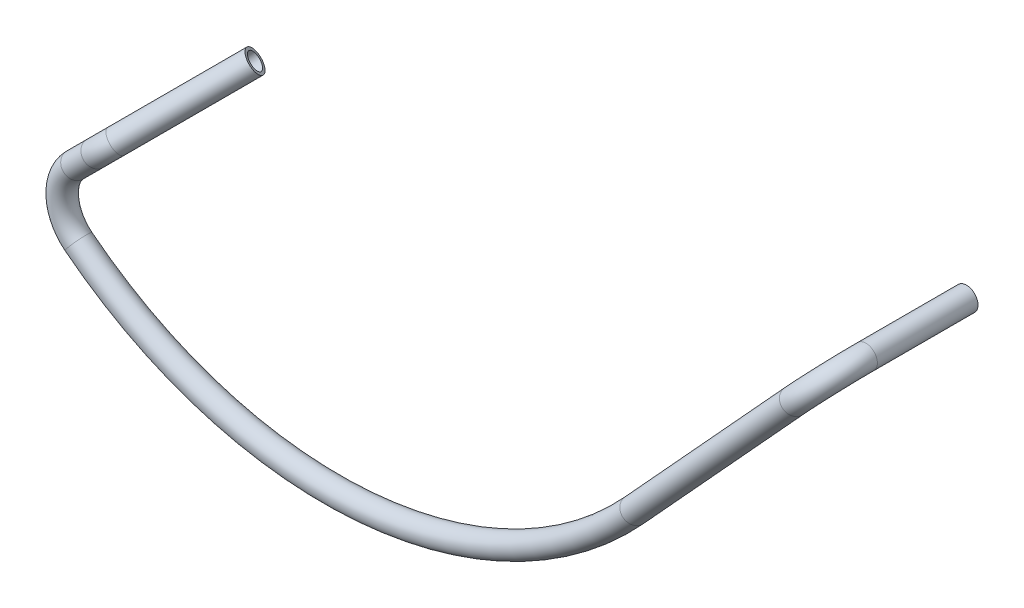
ISO-10303-21;
HEADER;
FILE_DESCRIPTION(('STEP AP214'),'2;1');
FILE_NAME('part.step','',(''),(''),'','','');
FILE_SCHEMA(('AUTOMOTIVE_DESIGN { 1 0 10303 214 1 1 1 1 }'));
ENDSEC;
DATA;
#1=APPLICATION_CONTEXT('core data for automotive mechanical design processes');
#2=APPLICATION_PROTOCOL_DEFINITION('international standard','automotive_design',2000,#1);
#3=PRODUCT_CONTEXT('',#1,'mechanical');
#4=PRODUCT('Part','Part','',(#3));
#5=PRODUCT_RELATED_PRODUCT_CATEGORY('part','',(#4));
#6=PRODUCT_DEFINITION_FORMATION('','',#4);
#7=PRODUCT_DEFINITION_CONTEXT('part definition',#1,'design');
#8=PRODUCT_DEFINITION('design','',#6,#7);
#9=PRODUCT_DEFINITION_SHAPE('','',#8);
#10=(LENGTH_UNIT() NAMED_UNIT(*) SI_UNIT(.MILLI.,.METRE.));
#11=(NAMED_UNIT(*) PLANE_ANGLE_UNIT() SI_UNIT($,.RADIAN.));
#12=(NAMED_UNIT(*) SI_UNIT($,.STERADIAN.) SOLID_ANGLE_UNIT());
#13=UNCERTAINTY_MEASURE_WITH_UNIT(LENGTH_MEASURE(1.E-05),#10,'distance_accuracy_value','');
#14=(GEOMETRIC_REPRESENTATION_CONTEXT(3) GLOBAL_UNCERTAINTY_ASSIGNED_CONTEXT((#13)) GLOBAL_UNIT_ASSIGNED_CONTEXT((#10,
#11,#12)) REPRESENTATION_CONTEXT('',''));
#15=CARTESIAN_POINT('',(0.,0.,0.));
#16=DIRECTION('',(0.,0.,1.));
#17=DIRECTION('',(1.,0.,0.));
#18=AXIS2_PLACEMENT_3D('',#15,#16,#17);
#19=CARTESIAN_POINT('',(-15.4388616812976,-15.4388616812976,-0.401923788646688));
#20=DIRECTION('',(0.612372435695795,0.612372435695793,-0.500000000000001));
#21=DIRECTION('',(-0.707106781186546,0.707106781186549,0.));
#22=AXIS2_PLACEMENT_3D('',#19,#20,#21);
#23=CYLINDRICAL_SURFACE('',#22,0.800000000000002);
#24=CARTESIAN_POINT('',(-15.4388616812976,-15.4388616812976,-0.401923788646688));
#25=DIRECTION('',(0.612372435695797,0.612372435695793,-0.499999999999999));
#26=DIRECTION('',(-0.282696040001626,0.760255488804051,0.584888485705362));
#27=AXIS2_PLACEMENT_3D('',#24,#25,#26);
#28=CIRCLE('',#27,0.800000000000002);
#29=CARTESIAN_POINT('',(-15.156018968823,-15.156018968823,0.290896534380864));
#30=VERTEX_POINT('',#29);
#31=EDGE_CURVE('E40',#30,#30,#28,.T.);
#32=ORIENTED_EDGE('',*,*,#31,.T.);
#33=EDGE_LOOP('',(#32));
#34=FACE_BOUND('',#33,.T.);
#35=CARTESIAN_POINT('',(-10.1135776410229,-10.1135776410229,-4.75000000000002));
#36=DIRECTION('',(0.612372435695797,0.612372435695793,-0.499999999999999));
#37=DIRECTION('',(-0.282696040001626,0.760255488804051,0.584888485705362));
#38=AXIS2_PLACEMENT_3D('',#35,#36,#37);
#39=CIRCLE('',#38,0.800000000000002);
#40=CARTESIAN_POINT('',(-10.3397344730242,-9.50537324997961,-4.28208921143572));
#41=VERTEX_POINT('',#40);
#42=EDGE_CURVE('E10',#41,#41,#39,.T.);
#43=ORIENTED_EDGE('',*,*,#42,.F.);
#44=EDGE_LOOP('',(#43));
#45=FACE_BOUND('',#44,.T.);
#46=ADVANCED_FACE('F30',(#34,#45),#23,.T.);
#47=CARTESIAN_POINT('',(-15.4388616812976,-15.4388616812976,-0.401923788646688));
#48=DIRECTION('',(0.612372435695795,0.612372435695793,-0.500000000000001));
#49=DIRECTION('',(-0.707106781186546,0.707106781186549,0.));
#50=AXIS2_PLACEMENT_3D('',#47,#48,#49);
#51=CYLINDRICAL_SURFACE('',#50,0.599999999999993);
#52=CARTESIAN_POINT('',(-15.4388616812976,-15.4388616812976,-0.401923788646688));
#53=DIRECTION('',(0.612372435695797,0.612372435695793,-0.499999999999999));
#54=DIRECTION('',(-0.282696040001626,0.760255488804051,0.584888485705362));
#55=AXIS2_PLACEMENT_3D('',#52,#53,#54);
#56=CIRCLE('',#55,0.599999999999993);
#57=CARTESIAN_POINT('',(-15.2267296469417,-15.2267296469416,0.117691453623968));
#58=VERTEX_POINT('',#57);
#59=EDGE_CURVE('E44',#58,#58,#56,.T.);
#60=ORIENTED_EDGE('',*,*,#59,.F.);
#61=EDGE_LOOP('',(#60));
#62=FACE_BOUND('',#61,.T.);
#63=CARTESIAN_POINT('',(-10.1135776410229,-10.1135776410229,-4.75000000000002));
#64=DIRECTION('',(0.612372435695797,0.612372435695793,-0.499999999999999));
#65=DIRECTION('',(-0.282696040001626,0.760255488804051,0.584888485705362));
#66=AXIS2_PLACEMENT_3D('',#63,#64,#65);
#67=CIRCLE('',#66,0.599999999999993);
#68=CARTESIAN_POINT('',(-10.2831952650239,-9.65742434774043,-4.3990669085768));
#69=VERTEX_POINT('',#68);
#70=EDGE_CURVE('E36',#69,#69,#67,.T.);
#71=ORIENTED_EDGE('',*,*,#70,.T.);
#72=EDGE_LOOP('',(#71));
#73=FACE_BOUND('',#72,.T.);
#74=ADVANCED_FACE('F137',(#62,#73),#51,.F.);
#75=CARTESIAN_POINT('',(-16.4995218530775,-16.4995218530774,-3.));
#76=DIRECTION('',(-0.707106781186546,0.707106781186549,0.));
#77=DIRECTION('',(-0.707106781186549,-0.707106781186546,0.));
#78=AXIS2_PLACEMENT_3D('',#75,#76,#77);
#79=TOROIDAL_SURFACE('',#78,3.,0.800000000000002);
#80=CARTESIAN_POINT('',(-16.4995218530775,-16.4995218530774,0.));
#81=DIRECTION('',(0.707106781186549,0.707106781186546,0.));
#82=DIRECTION('',(-0.521475764402839,0.521475764402839,0.675371049335807));
#83=AXIS2_PLACEMENT_3D('',#80,#81,#82);
#84=CIRCLE('',#83,0.800000000000002);
#85=CARTESIAN_POINT('',(-16.4995218530775,-16.4995218530774,0.800000000000001));
#86=VERTEX_POINT('',#85);
#87=EDGE_CURVE('E49',#86,#86,#84,.T.);
#88=CARTESIAN_POINT('',(-16.4995218530775,-16.4995218530774,-3.));
#89=DIRECTION('',(-0.707106781186546,0.707106781186549,0.));
#90=DIRECTION('',(-0.707106781186549,-0.707106781186546,0.));
#91=AXIS2_PLACEMENT_3D('',#88,#89,#90);
#92=CIRCLE('',#91,3.8);
#93=EDGE_CURVE('',#86,#30,#92,.T.);
#94=ORIENTED_EDGE('',*,*,#87,.T.);
#95=ORIENTED_EDGE('',*,*,#31,.F.);
#96=ORIENTED_EDGE('',*,*,#93,.T.);
#97=ORIENTED_EDGE('',*,*,#93,.F.);
#98=EDGE_LOOP('',(#94,#96,#95,#97));
#99=FACE_BOUND('',#98,.T.);
#100=ADVANCED_FACE('F133',(#99),#79,.T.);
#101=CARTESIAN_POINT('',(-16.4995218530775,-16.4995218530774,-3.));
#102=DIRECTION('',(-0.707106781186546,0.707106781186549,0.));
#103=DIRECTION('',(-0.707106781186549,-0.707106781186546,0.));
#104=AXIS2_PLACEMENT_3D('',#101,#102,#103);
#105=TOROIDAL_SURFACE('',#104,3.,0.599999999999993);
#106=CARTESIAN_POINT('',(-16.4995218530775,-16.4995218530774,0.));
#107=DIRECTION('',(0.707106781186549,0.707106781186546,0.));
#108=DIRECTION('',(-0.521475764402839,0.521475764402839,0.675371049335807));
#109=AXIS2_PLACEMENT_3D('',#106,#107,#108);
#110=CIRCLE('',#109,0.599999999999993);
#111=CARTESIAN_POINT('',(-16.4995218530775,-16.4995218530774,0.599999999999992));
#112=VERTEX_POINT('',#111);
#113=EDGE_CURVE('E52',#112,#112,#110,.T.);
#114=CARTESIAN_POINT('',(-16.4995218530775,-16.4995218530774,-3.));
#115=DIRECTION('',(-0.707106781186546,0.707106781186549,0.));
#116=DIRECTION('',(-0.707106781186549,-0.707106781186546,0.));
#117=AXIS2_PLACEMENT_3D('',#114,#115,#116);
#118=CIRCLE('',#117,3.59999999999999);
#119=EDGE_CURVE('',#112,#58,#118,.T.);
#120=ORIENTED_EDGE('',*,*,#113,.F.);
#121=ORIENTED_EDGE('',*,*,#59,.T.);
#122=ORIENTED_EDGE('',*,*,#119,.T.);
#123=ORIENTED_EDGE('',*,*,#119,.F.);
#124=EDGE_LOOP('',(#120,#122,#121,#123));
#125=FACE_BOUND('',#124,.T.);
#126=ADVANCED_FACE('F130',(#125),#105,.F.);
#127=CARTESIAN_POINT('',(-17.90600457947,-17.90600457947,0.));
#128=DIRECTION('',(0.707106781186548,0.707106781186547,0.));
#129=DIRECTION('',(-0.707106781186547,0.707106781186548,0.));
#130=AXIS2_PLACEMENT_3D('',#127,#128,#129);
#131=CYLINDRICAL_SURFACE('',#130,0.800000000000002);
#132=CARTESIAN_POINT('',(-17.90600457947,-17.90600457947,0.));
#133=DIRECTION('',(0.707106781186549,0.707106781186546,0.));
#134=DIRECTION('',(-0.521475764402839,0.521475764402839,0.675371049335807));
#135=AXIS2_PLACEMENT_3D('',#132,#133,#134);
#136=CIRCLE('',#135,0.800000000000002);
#137=CARTESIAN_POINT('',(-18.4716900044193,-17.3403191545207,0.));
#138=VERTEX_POINT('',#137);
#139=EDGE_CURVE('E55',#138,#138,#136,.T.);
#140=ORIENTED_EDGE('',*,*,#139,.T.);
#141=EDGE_LOOP('',(#140));
#142=FACE_BOUND('',#141,.T.);
#143=ORIENTED_EDGE('',*,*,#87,.F.);
#144=EDGE_LOOP('',(#143));
#145=FACE_BOUND('',#144,.T.);
#146=ADVANCED_FACE('F126',(#142,#145),#131,.T.);
#147=CARTESIAN_POINT('',(-17.90600457947,-17.90600457947,0.));
#148=DIRECTION('',(0.707106781186548,0.707106781186547,0.));
#149=DIRECTION('',(-0.707106781186547,0.707106781186548,0.));
#150=AXIS2_PLACEMENT_3D('',#147,#148,#149);
#151=CYLINDRICAL_SURFACE('',#150,0.599999999999993);
#152=CARTESIAN_POINT('',(-17.90600457947,-17.90600457947,0.));
#153=DIRECTION('',(0.707106781186549,0.707106781186546,0.));
#154=DIRECTION('',(-0.521475764402839,0.521475764402839,0.675371049335807));
#155=AXIS2_PLACEMENT_3D('',#152,#153,#154);
#156=CIRCLE('',#155,0.599999999999993);
#157=CARTESIAN_POINT('',(-18.3302686481819,-17.481740510758,0.));
#158=VERTEX_POINT('',#157);
#159=EDGE_CURVE('E58',#158,#158,#156,.T.);
#160=ORIENTED_EDGE('',*,*,#159,.F.);
#161=EDGE_LOOP('',(#160));
#162=FACE_BOUND('',#161,.T.);
#163=ORIENTED_EDGE('',*,*,#113,.T.);
#164=EDGE_LOOP('',(#163));
#165=FACE_BOUND('',#164,.T.);
#166=ADVANCED_FACE('F123',(#162,#165),#151,.F.);
#167=CARTESIAN_POINT('',(-15.7846842359104,-20.0273249230296,0.));
#168=DIRECTION('',(0.,0.,-1.));
#169=DIRECTION('',(-1.,0.,0.));
#170=AXIS2_PLACEMENT_3D('',#167,#168,#169);
#171=TOROIDAL_SURFACE('',#170,3.,0.800000000000002);
#172=CARTESIAN_POINT('',(-17.6417059107234,-22.3834807963272,0.));
#173=DIRECTION('',(-0.785385291099199,0.619007224937663,0.));
#174=DIRECTION('',(-0.456504271184591,-0.579204451044082,0.675371049335807));
#175=AXIS2_PLACEMENT_3D('',#172,#173,#174);
#176=CIRCLE('',#175,0.800000000000002);
#177=CARTESIAN_POINT('',(-18.1369116906735,-23.0117890292066,0.));
#178=VERTEX_POINT('',#177);
#179=EDGE_CURVE('E61',#178,#178,#176,.T.);
#180=CARTESIAN_POINT('',(-15.7846842359104,-20.0273249230296,0.));
#181=DIRECTION('',(0.,0.,-1.));
#182=DIRECTION('',(-1.,0.,0.));
#183=AXIS2_PLACEMENT_3D('',#180,#181,#182);
#184=CIRCLE('',#183,3.8);
#185=EDGE_CURVE('',#178,#138,#184,.T.);
#186=ORIENTED_EDGE('',*,*,#179,.T.);
#187=ORIENTED_EDGE('',*,*,#139,.F.);
#188=ORIENTED_EDGE('',*,*,#185,.T.);
#189=ORIENTED_EDGE('',*,*,#185,.F.);
#190=EDGE_LOOP('',(#186,#188,#187,#189));
#191=FACE_BOUND('',#190,.T.);
#192=ADVANCED_FACE('F119',(#191),#171,.T.);
#193=CARTESIAN_POINT('',(-15.7846842359104,-20.0273249230296,0.));
#194=DIRECTION('',(0.,0.,-1.));
#195=DIRECTION('',(-1.,0.,0.));
#196=AXIS2_PLACEMENT_3D('',#193,#194,#195);
#197=TOROIDAL_SURFACE('',#196,3.,0.599999999999993);
#198=CARTESIAN_POINT('',(-17.6417059107234,-22.3834807963272,0.));
#199=DIRECTION('',(-0.785385291099199,0.619007224937663,0.));
#200=DIRECTION('',(-0.456504271184591,-0.579204451044082,0.675371049335807));
#201=AXIS2_PLACEMENT_3D('',#198,#199,#200);
#202=CIRCLE('',#201,0.599999999999993);
#203=CARTESIAN_POINT('',(-18.013110245686,-22.8547119709867,0.));
#204=VERTEX_POINT('',#203);
#205=EDGE_CURVE('E64',#204,#204,#202,.T.);
#206=CARTESIAN_POINT('',(-15.7846842359104,-20.0273249230296,0.));
#207=DIRECTION('',(0.,0.,-1.));
#208=DIRECTION('',(-1.,0.,0.));
#209=AXIS2_PLACEMENT_3D('',#206,#207,#208);
#210=CIRCLE('',#209,3.59999999999999);
#211=EDGE_CURVE('',#204,#158,#210,.T.);
#212=ORIENTED_EDGE('',*,*,#205,.F.);
#213=ORIENTED_EDGE('',*,*,#159,.T.);
#214=ORIENTED_EDGE('',*,*,#211,.T.);
#215=ORIENTED_EDGE('',*,*,#211,.F.);
#216=EDGE_LOOP('',(#212,#214,#213,#215));
#217=FACE_BOUND('',#216,.T.);
#218=ADVANCED_FACE('F116',(#217),#197,.F.);
#219=CARTESIAN_POINT('',(0.,0.,0.));
#220=DIRECTION('',(0.,0.,-1.));
#221=DIRECTION('',(-1.,0.,0.));
#222=AXIS2_PLACEMENT_3D('',#219,#220,#221);
#223=TOROIDAL_SURFACE('',#222,28.5,0.800000000000002);
#224=CARTESIAN_POINT('',(21.0181258063201,-19.2480749060705,0.));
#225=DIRECTION('',(-0.675371049335808,-0.737478098467371,0.));
#226=DIRECTION('',(0.543873945719051,-0.498071357224084,0.675371049335807));
#227=AXIS2_PLACEMENT_3D('',#224,#225,#226);
#228=CIRCLE('',#227,0.800000000000002);
#229=CARTESIAN_POINT('',(21.608108285094,-19.7883717455391,0.));
#230=VERTEX_POINT('',#229);
#231=EDGE_CURVE('E67',#230,#230,#228,.T.);
#232=CARTESIAN_POINT('',(0.,0.,0.));
#233=DIRECTION('',(0.,0.,-1.));
#234=DIRECTION('',(-1.,0.,0.));
#235=AXIS2_PLACEMENT_3D('',#232,#233,#234);
#236=CIRCLE('',#235,29.3);
#237=EDGE_CURVE('',#230,#178,#236,.T.);
#238=ORIENTED_EDGE('',*,*,#231,.T.);
#239=ORIENTED_EDGE('',*,*,#179,.F.);
#240=ORIENTED_EDGE('',*,*,#237,.T.);
#241=ORIENTED_EDGE('',*,*,#237,.F.);
#242=EDGE_LOOP('',(#238,#240,#239,#241));
#243=FACE_BOUND('',#242,.T.);
#244=ADVANCED_FACE('F112',(#243),#223,.T.);
#245=CARTESIAN_POINT('',(0.,0.,0.));
#246=DIRECTION('',(0.,0.,-1.));
#247=DIRECTION('',(-1.,0.,0.));
#248=AXIS2_PLACEMENT_3D('',#245,#246,#247);
#249=TOROIDAL_SURFACE('',#248,28.5,0.599999999999993);
#250=CARTESIAN_POINT('',(21.0181258063201,-19.2480749060705,0.));
#251=DIRECTION('',(-0.675371049335808,-0.737478098467371,0.));
#252=DIRECTION('',(0.543873945719051,-0.498071357224084,0.675371049335807));
#253=AXIS2_PLACEMENT_3D('',#250,#251,#252);
#254=CIRCLE('',#253,0.599999999999993);
#255=CARTESIAN_POINT('',(21.4606126654005,-19.653297535672,0.));
#256=VERTEX_POINT('',#255);
#257=EDGE_CURVE('E70',#256,#256,#254,.T.);
#258=CARTESIAN_POINT('',(0.,0.,0.));
#259=DIRECTION('',(0.,0.,-1.));
#260=DIRECTION('',(-1.,0.,0.));
#261=AXIS2_PLACEMENT_3D('',#258,#259,#260);
#262=CIRCLE('',#261,29.1);
#263=EDGE_CURVE('',#256,#204,#262,.T.);
#264=ORIENTED_EDGE('',*,*,#257,.F.);
#265=ORIENTED_EDGE('',*,*,#205,.T.);
#266=ORIENTED_EDGE('',*,*,#263,.T.);
#267=ORIENTED_EDGE('',*,*,#263,.F.);
#268=EDGE_LOOP('',(#264,#266,#265,#267));
#269=FACE_BOUND('',#268,.T.);
#270=ADVANCED_FACE('F109',(#269),#249,.F.);
#271=CARTESIAN_POINT('',(32.1227265961837,-7.12229622070679,0.));
#272=DIRECTION('',(-0.675371049335807,-0.737478098467372,0.));
#273=DIRECTION('',(0.737478098467372,-0.675371049335807,0.));
#274=AXIS2_PLACEMENT_3D('',#271,#272,#273);
#275=CYLINDRICAL_SURFACE('',#274,0.800000000000002);
#276=CARTESIAN_POINT('',(32.1227265961837,-7.12229622070679,0.));
#277=DIRECTION('',(-0.675371049335808,-0.737478098467371,0.));
#278=DIRECTION('',(0.543873945719051,-0.498071357224084,0.675371049335807));
#279=AXIS2_PLACEMENT_3D('',#276,#277,#278);
#280=CIRCLE('',#279,0.800000000000002);
#281=CARTESIAN_POINT('',(32.1227265961837,-7.12229622070679,0.800000000000004));
#282=VERTEX_POINT('',#281);
#283=EDGE_CURVE('E73',#282,#282,#280,.T.);
#284=ORIENTED_EDGE('',*,*,#283,.T.);
#285=EDGE_LOOP('',(#284));
#286=FACE_BOUND('',#285,.T.);
#287=ORIENTED_EDGE('',*,*,#231,.F.);
#288=EDGE_LOOP('',(#287));
#289=FACE_BOUND('',#288,.T.);
#290=ADVANCED_FACE('F105',(#286,#289),#275,.T.);
#291=CARTESIAN_POINT('',(32.1227265961837,-7.12229622070679,0.));
#292=DIRECTION('',(-0.675371049335807,-0.737478098467372,0.));
#293=DIRECTION('',(0.737478098467372,-0.675371049335807,0.));
#294=AXIS2_PLACEMENT_3D('',#291,#292,#293);
#295=CYLINDRICAL_SURFACE('',#294,0.599999999999993);
#296=CARTESIAN_POINT('',(32.1227265961837,-7.12229622070679,0.));
#297=DIRECTION('',(-0.675371049335808,-0.737478098467371,0.));
#298=DIRECTION('',(0.543873945719051,-0.498071357224084,0.675371049335807));
#299=AXIS2_PLACEMENT_3D('',#296,#297,#298);
#300=CIRCLE('',#299,0.599999999999993);
#301=CARTESIAN_POINT('',(32.1227265961837,-7.12229622070679,0.599999999999995));
#302=VERTEX_POINT('',#301);
#303=EDGE_CURVE('E76',#302,#302,#300,.T.);
#304=ORIENTED_EDGE('',*,*,#303,.F.);
#305=EDGE_LOOP('',(#304));
#306=FACE_BOUND('',#305,.T.);
#307=ORIENTED_EDGE('',*,*,#257,.T.);
#308=EDGE_LOOP('',(#307));
#309=FACE_BOUND('',#308,.T.);
#310=ADVANCED_FACE('F102',(#306,#309),#295,.F.);
#311=CARTESIAN_POINT('',(32.1227265961837,-7.12229622070679,-3.));
#312=DIRECTION('',(0.737478098467372,-0.675371049335807,0.));
#313=DIRECTION('',(0.675371049335807,0.737478098467372,0.));
#314=AXIS2_PLACEMENT_3D('',#311,#312,#313);
#315=TOROIDAL_SURFACE('',#314,3.,0.800000000000002);
#316=CARTESIAN_POINT('',(34.1488397441911,-4.90986192530467,-3.));
#317=DIRECTION('',(0.,0.,1.));
#318=DIRECTION('',(1.,0.,0.));
#319=AXIS2_PLACEMENT_3D('',#316,#317,#318);
#320=CIRCLE('',#319,0.800000000000002);
#321=CARTESIAN_POINT('',(34.6891365836597,-4.31987944653077,-3.));
#322=VERTEX_POINT('',#321);
#323=EDGE_CURVE('E79',#322,#322,#320,.T.);
#324=CARTESIAN_POINT('',(32.1227265961837,-7.12229622070679,-3.));
#325=DIRECTION('',(0.737478098467372,-0.675371049335807,0.));
#326=DIRECTION('',(0.675371049335807,0.737478098467372,0.));
#327=AXIS2_PLACEMENT_3D('',#324,#325,#326);
#328=CIRCLE('',#327,3.8);
#329=EDGE_CURVE('',#322,#282,#328,.T.);
#330=ORIENTED_EDGE('',*,*,#323,.T.);
#331=ORIENTED_EDGE('',*,*,#283,.F.);
#332=ORIENTED_EDGE('',*,*,#329,.T.);
#333=ORIENTED_EDGE('',*,*,#329,.F.);
#334=EDGE_LOOP('',(#330,#332,#331,#333));
#335=FACE_BOUND('',#334,.T.);
#336=ADVANCED_FACE('F98',(#335),#315,.T.);
#337=CARTESIAN_POINT('',(32.1227265961837,-7.12229622070679,-3.));
#338=DIRECTION('',(0.737478098467372,-0.675371049335807,0.));
#339=DIRECTION('',(0.675371049335807,0.737478098467372,0.));
#340=AXIS2_PLACEMENT_3D('',#337,#338,#339);
#341=TOROIDAL_SURFACE('',#340,3.,0.599999999999993);
#342=CARTESIAN_POINT('',(34.1488397441911,-4.90986192530467,-3.));
#343=DIRECTION('',(0.,0.,1.));
#344=DIRECTION('',(1.,0.,0.));
#345=AXIS2_PLACEMENT_3D('',#342,#343,#344);
#346=CIRCLE('',#345,0.599999999999993);
#347=CARTESIAN_POINT('',(34.5540623737926,-4.46737506622426,-3.));
#348=VERTEX_POINT('',#347);
#349=EDGE_CURVE('E83',#348,#348,#346,.T.);
#350=CARTESIAN_POINT('',(32.1227265961837,-7.12229622070679,-3.));
#351=DIRECTION('',(0.737478098467372,-0.675371049335807,0.));
#352=DIRECTION('',(0.675371049335807,0.737478098467372,0.));
#353=AXIS2_PLACEMENT_3D('',#350,#351,#352);
#354=CIRCLE('',#353,3.59999999999999);
#355=EDGE_CURVE('',#348,#302,#354,.T.);
#356=ORIENTED_EDGE('',*,*,#349,.F.);
#357=ORIENTED_EDGE('',*,*,#303,.T.);
#358=ORIENTED_EDGE('',*,*,#355,.T.);
#359=ORIENTED_EDGE('',*,*,#355,.F.);
#360=EDGE_LOOP('',(#356,#358,#357,#359));
#361=FACE_BOUND('',#360,.T.);
#362=ADVANCED_FACE('F95',(#361),#341,.F.);
#363=CARTESIAN_POINT('',(34.1488397441911,-4.90986192530467,-3.));
#364=DIRECTION('',(0.,0.,-1.));
#365=DIRECTION('',(0.,1.,0.));
#366=AXIS2_PLACEMENT_3D('',#363,#364,#365);
#367=CYLINDRICAL_SURFACE('',#366,0.599999999999993);
#368=ORIENTED_EDGE('',*,*,#349,.T.);
#369=EDGE_LOOP('',(#368));
#370=FACE_BOUND('',#369,.T.);
#371=CARTESIAN_POINT('',(34.1488397441911,-4.90986192530467,-10.));
#372=DIRECTION('',(0.,0.,1.));
#373=DIRECTION('',(1.,0.,0.));
#374=AXIS2_PLACEMENT_3D('',#371,#372,#373);
#375=CIRCLE('',#374,0.599999999999993);
#376=CARTESIAN_POINT('',(34.7488397441911,-4.90986192530467,-10.));
#377=VERTEX_POINT('',#376);
#378=EDGE_CURVE('E84',#377,#377,#375,.T.);
#379=ORIENTED_EDGE('',*,*,#378,.F.);
#380=EDGE_LOOP('',(#379));
#381=FACE_BOUND('',#380,.T.);
#382=ADVANCED_FACE('F92',(#370,#381),#367,.F.);
#383=CARTESIAN_POINT('',(34.1488397441911,-4.90986192530467,-3.));
#384=DIRECTION('',(0.,0.,-1.));
#385=DIRECTION('',(0.,1.,0.));
#386=AXIS2_PLACEMENT_3D('',#383,#384,#385);
#387=CYLINDRICAL_SURFACE('',#386,0.800000000000002);
#388=ORIENTED_EDGE('',*,*,#323,.F.);
#389=EDGE_LOOP('',(#388));
#390=FACE_BOUND('',#389,.T.);
#391=CARTESIAN_POINT('',(34.1488397441911,-4.90986192530467,-10.));
#392=DIRECTION('',(0.,0.,1.));
#393=DIRECTION('',(1.,0.,0.));
#394=AXIS2_PLACEMENT_3D('',#391,#392,#393);
#395=CIRCLE('',#394,0.800000000000002);
#396=CARTESIAN_POINT('',(34.9488397441911,-4.90986192530467,-10.));
#397=VERTEX_POINT('',#396);
#398=EDGE_CURVE('E80',#397,#397,#395,.T.);
#399=ORIENTED_EDGE('',*,*,#398,.T.);
#400=EDGE_LOOP('',(#399));
#401=FACE_BOUND('',#400,.T.);
#402=ADVANCED_FACE('F164',(#390,#401),#387,.T.);
#403=CARTESIAN_POINT('',(-10.1135776410229,-10.1135776410229,-4.75000000000002));
#404=DIRECTION('',(0.612372435695797,0.612372435695793,-0.499999999999999));
#405=DIRECTION('',(-0.282696040001626,0.760255488804051,0.584888485705362));
#406=AXIS2_PLACEMENT_3D('',#403,#404,#405);
#407=PLANE('',#406);
#408=ORIENTED_EDGE('',*,*,#70,.F.);
#409=EDGE_LOOP('',(#408));
#410=FACE_BOUND('',#409,.T.);
#411=ORIENTED_EDGE('',*,*,#42,.T.);
#412=EDGE_LOOP('',(#411));
#413=FACE_BOUND('',#412,.T.);
#414=ADVANCED_FACE('F167',(#410,#413),#407,.T.);
#415=CARTESIAN_POINT('',(34.1488397441911,-4.90986192530467,-10.));
#416=DIRECTION('',(0.,0.,1.));
#417=DIRECTION('',(1.,0.,0.));
#418=AXIS2_PLACEMENT_3D('',#415,#416,#417);
#419=PLANE('',#418);
#420=ORIENTED_EDGE('',*,*,#378,.T.);
#421=EDGE_LOOP('',(#420));
#422=FACE_BOUND('',#421,.T.);
#423=ORIENTED_EDGE('',*,*,#398,.F.);
#424=EDGE_LOOP('',(#423));
#425=FACE_BOUND('',#424,.T.);
#426=ADVANCED_FACE('F169',(#422,#425),#419,.F.);
#427=CLOSED_SHELL('',(#46,#74,#100,#126,#146,#166,#192,#218,#244,#270,#290,#310,#336,#362,#382,
#402,#414,#426));
#428=MANIFOLD_SOLID_BREP('B2',#427);
#429=ADVANCED_BREP_SHAPE_REPRESENTATION('',(#18,#428),#14);
#430=SHAPE_DEFINITION_REPRESENTATION(#9,#429);
ENDSEC;
END-ISO-10303-21;
